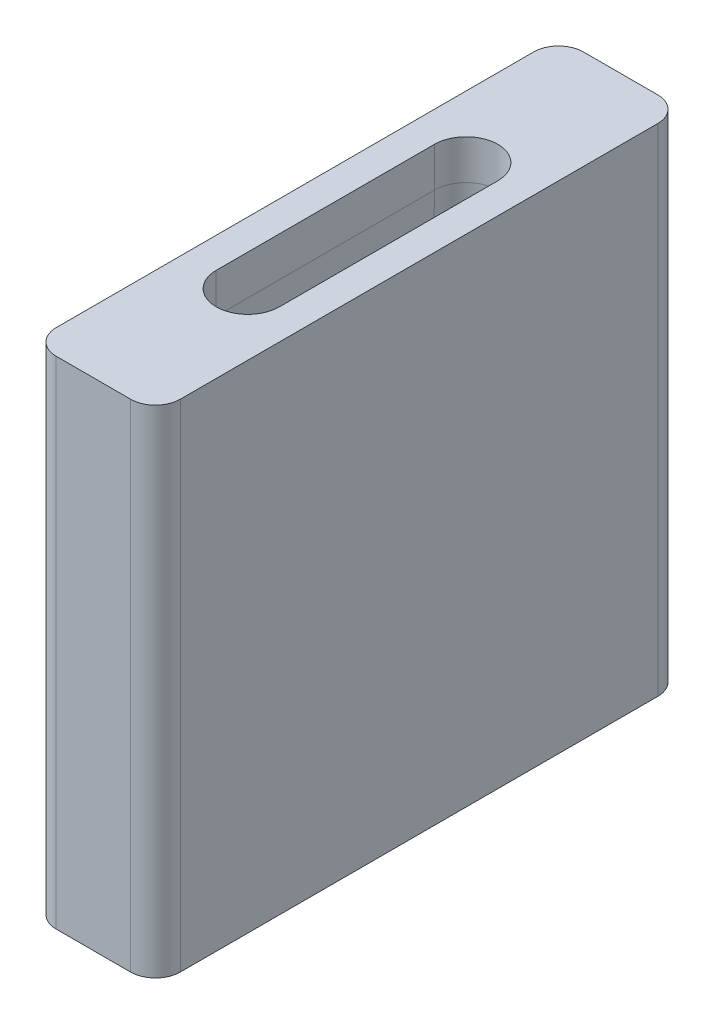
ISO-10303-21;
HEADER;
FILE_DESCRIPTION(('STEP AP214'),'2;1');
FILE_NAME('part.step','',(''),(''),'','','');
FILE_SCHEMA(('AUTOMOTIVE_DESIGN { 1 0 10303 214 1 1 1 1 }'));
ENDSEC;
DATA;
#1=APPLICATION_CONTEXT('core data for automotive mechanical design processes');
#2=APPLICATION_PROTOCOL_DEFINITION('international standard','automotive_design',2000,#1);
#3=PRODUCT_CONTEXT('',#1,'mechanical');
#4=PRODUCT('Part','Part','',(#3));
#5=PRODUCT_RELATED_PRODUCT_CATEGORY('part','',(#4));
#6=PRODUCT_DEFINITION_FORMATION('','',#4);
#7=PRODUCT_DEFINITION_CONTEXT('part definition',#1,'design');
#8=PRODUCT_DEFINITION('design','',#6,#7);
#9=PRODUCT_DEFINITION_SHAPE('','',#8);
#10=(LENGTH_UNIT() NAMED_UNIT(*) SI_UNIT(.MILLI.,.METRE.));
#11=(NAMED_UNIT(*) PLANE_ANGLE_UNIT() SI_UNIT($,.RADIAN.));
#12=(NAMED_UNIT(*) SI_UNIT($,.STERADIAN.) SOLID_ANGLE_UNIT());
#13=UNCERTAINTY_MEASURE_WITH_UNIT(LENGTH_MEASURE(1.E-05),#10,'distance_accuracy_value','');
#14=(GEOMETRIC_REPRESENTATION_CONTEXT(3) GLOBAL_UNCERTAINTY_ASSIGNED_CONTEXT((#13)) GLOBAL_UNIT_ASSIGNED_CONTEXT((#10,
#11,#12)) REPRESENTATION_CONTEXT('',''));
#15=CARTESIAN_POINT('',(0.,0.,0.));
#16=DIRECTION('',(0.,0.,1.));
#17=DIRECTION('',(1.,0.,0.));
#18=AXIS2_PLACEMENT_3D('',#15,#16,#17);
#19=CARTESIAN_POINT('',(0.,-40.001,8.8));
#20=DIRECTION('',(0.,1.,0.));
#21=DIRECTION('',(0.,0.,1.));
#22=AXIS2_PLACEMENT_3D('',#19,#20,#21);
#23=CYLINDRICAL_SURFACE('',#22,2.55);
#24=CARTESIAN_POINT('',(0.,-3.2,8.8));
#25=DIRECTION('',(0.,1.,0.));
#26=DIRECTION('',(-1.,0.,0.));
#27=AXIS2_PLACEMENT_3D('',#24,#25,#26);
#28=CIRCLE('',#27,2.55);
#29=CARTESIAN_POINT('',(-2.55,-3.2,8.8));
#30=VERTEX_POINT('',#29);
#31=CARTESIAN_POINT('',(2.55,-3.20000000000065,8.8));
#32=VERTEX_POINT('',#31);
#33=EDGE_CURVE('E75',#30,#32,#28,.T.);
#34=ORIENTED_EDGE('',*,*,#33,.F.);
#35=DIRECTION('',(0.,1.,0.));
#36=VECTOR('',#35,1.);
#37=CARTESIAN_POINT('',(-2.55,-40.001,8.8));
#38=LINE('',#37,#36);
#39=CARTESIAN_POINT('',(-2.55,0.,8.8));
#40=VERTEX_POINT('',#39);
#41=EDGE_CURVE('E238',#30,#40,#38,.T.);
#42=ORIENTED_EDGE('',*,*,#41,.T.);
#43=CARTESIAN_POINT('',(0.,0.,8.8));
#44=DIRECTION('',(0.,1.,0.));
#45=DIRECTION('',(0.,0.,1.));
#46=AXIS2_PLACEMENT_3D('',#43,#44,#45);
#47=CIRCLE('',#46,2.55);
#48=CARTESIAN_POINT('',(2.55,0.,8.8));
#49=VERTEX_POINT('',#48);
#50=EDGE_CURVE('E224',#40,#49,#47,.T.);
#51=ORIENTED_EDGE('',*,*,#50,.T.);
#52=DIRECTION('',(0.,1.,0.));
#53=VECTOR('',#52,1.);
#54=CARTESIAN_POINT('',(2.55,-40.001,8.8));
#55=LINE('',#54,#53);
#56=EDGE_CURVE('E237',#32,#49,#55,.T.);
#57=ORIENTED_EDGE('',*,*,#56,.F.);
#58=EDGE_LOOP('',(#34,#42,#51,#57));
#59=FACE_BOUND('',#58,.T.);
#60=ADVANCED_FACE('F51',(#59),#23,.F.);
#61=CARTESIAN_POINT('',(-2.55,-40.001,8.8));
#62=DIRECTION('',(-1.,0.,0.));
#63=DIRECTION('',(0.,0.,1.));
#64=AXIS2_PLACEMENT_3D('',#61,#62,#63);
#65=PLANE('',#64);
#66=DIRECTION('',(0.,0.,1.));
#67=VECTOR('',#66,1.);
#68=CARTESIAN_POINT('',(-2.55,-3.2,-8.8));
#69=LINE('',#68,#67);
#70=CARTESIAN_POINT('',(-2.55,-3.2,-8.8));
#71=VERTEX_POINT('',#70);
#72=EDGE_CURVE('E212',#71,#30,#69,.T.);
#73=ORIENTED_EDGE('',*,*,#72,.F.);
#74=DIRECTION('',(0.,1.,0.));
#75=VECTOR('',#74,1.);
#76=CARTESIAN_POINT('',(-2.55,-40.001,-8.8));
#77=LINE('',#76,#75);
#78=CARTESIAN_POINT('',(-2.55,0.,-8.8));
#79=VERTEX_POINT('',#78);
#80=EDGE_CURVE('E241',#71,#79,#77,.T.);
#81=ORIENTED_EDGE('',*,*,#80,.T.);
#82=DIRECTION('',(0.,0.,1.));
#83=VECTOR('',#82,1.);
#84=CARTESIAN_POINT('',(-2.55,0.,8.8));
#85=LINE('',#84,#83);
#86=EDGE_CURVE('E234',#79,#40,#85,.T.);
#87=ORIENTED_EDGE('',*,*,#86,.T.);
#88=ORIENTED_EDGE('',*,*,#41,.F.);
#89=EDGE_LOOP('',(#73,#81,#87,#88));
#90=FACE_BOUND('',#89,.T.);
#91=ADVANCED_FACE('F346',(#90),#65,.F.);
#92=CARTESIAN_POINT('',(0.,-40.001,-8.8));
#93=DIRECTION('',(0.,1.,0.));
#94=DIRECTION('',(0.,0.,1.));
#95=AXIS2_PLACEMENT_3D('',#92,#93,#94);
#96=CYLINDRICAL_SURFACE('',#95,2.55);
#97=CARTESIAN_POINT('',(0.,-3.2,-8.8));
#98=DIRECTION('',(0.,1.,0.));
#99=DIRECTION('',(1.,0.,0.));
#100=AXIS2_PLACEMENT_3D('',#97,#98,#99);
#101=CIRCLE('',#100,2.55);
#102=CARTESIAN_POINT('',(2.55,-3.2,-8.8));
#103=VERTEX_POINT('',#102);
#104=EDGE_CURVE('E204',#103,#71,#101,.T.);
#105=ORIENTED_EDGE('',*,*,#104,.F.);
#106=DIRECTION('',(0.,1.,0.));
#107=VECTOR('',#106,1.);
#108=CARTESIAN_POINT('',(2.55,-40.001,-8.8));
#109=LINE('',#108,#107);
#110=CARTESIAN_POINT('',(2.55,0.,-8.8));
#111=VERTEX_POINT('',#110);
#112=EDGE_CURVE('E243',#103,#111,#109,.T.);
#113=ORIENTED_EDGE('',*,*,#112,.T.);
#114=CARTESIAN_POINT('',(0.,0.,-8.8));
#115=DIRECTION('',(0.,1.,0.));
#116=DIRECTION('',(0.,0.,1.));
#117=AXIS2_PLACEMENT_3D('',#114,#115,#116);
#118=CIRCLE('',#117,2.55);
#119=EDGE_CURVE('E231',#111,#79,#118,.T.);
#120=ORIENTED_EDGE('',*,*,#119,.T.);
#121=ORIENTED_EDGE('',*,*,#80,.F.);
#122=EDGE_LOOP('',(#105,#113,#120,#121));
#123=FACE_BOUND('',#122,.T.);
#124=ADVANCED_FACE('F353',(#123),#96,.F.);
#125=CARTESIAN_POINT('',(2.55,-40.001,8.8));
#126=DIRECTION('',(1.,0.,0.));
#127=DIRECTION('',(0.,0.,-1.));
#128=AXIS2_PLACEMENT_3D('',#125,#126,#127);
#129=PLANE('',#128);
#130=DIRECTION('',(0.,0.,-1.));
#131=VECTOR('',#130,1.);
#132=CARTESIAN_POINT('',(2.55,-3.2,0.));
#133=LINE('',#132,#131);
#134=CARTESIAN_POINT('',(2.55,-3.2,0.));
#135=VERTEX_POINT('',#134);
#136=EDGE_CURVE('E196',#135,#103,#133,.T.);
#137=ORIENTED_EDGE('',*,*,#136,.F.);
#138=DIRECTION('',(0.,0.,-1.));
#139=VECTOR('',#138,1.);
#140=CARTESIAN_POINT('',(2.55,-3.2,8.8));
#141=LINE('',#140,#139);
#142=EDGE_CURVE('E221',#32,#135,#141,.T.);
#143=ORIENTED_EDGE('',*,*,#142,.F.);
#144=ORIENTED_EDGE('',*,*,#56,.T.);
#145=DIRECTION('',(0.,0.,-1.));
#146=VECTOR('',#145,1.);
#147=CARTESIAN_POINT('',(2.55,0.,8.8));
#148=LINE('',#147,#146);
#149=EDGE_CURVE('E228',#49,#111,#148,.T.);
#150=ORIENTED_EDGE('',*,*,#149,.T.);
#151=ORIENTED_EDGE('',*,*,#112,.F.);
#152=EDGE_LOOP('',(#137,#143,#144,#150,#151));
#153=FACE_BOUND('',#152,.T.);
#154=ADVANCED_FACE('F358',(#153),#129,.F.);
#155=CARTESIAN_POINT('',(-3.,-40.,19.25));
#156=DIRECTION('',(0.,1.,0.));
#157=DIRECTION('',(0.,0.,1.));
#158=AXIS2_PLACEMENT_3D('',#155,#156,#157);
#159=CYLINDRICAL_SURFACE('',#158,2.);
#160=CARTESIAN_POINT('',(-3.,0.,19.25));
#161=DIRECTION('',(0.,1.,0.));
#162=DIRECTION('',(0.,0.,-1.));
#163=AXIS2_PLACEMENT_3D('',#160,#161,#162);
#164=CIRCLE('',#163,2.);
#165=CARTESIAN_POINT('',(-5.,0.,19.25));
#166=VERTEX_POINT('',#165);
#167=CARTESIAN_POINT('',(-3.,0.,21.25));
#168=VERTEX_POINT('',#167);
#169=EDGE_CURVE('E240',#166,#168,#164,.T.);
#170=ORIENTED_EDGE('',*,*,#169,.F.);
#171=DIRECTION('',(0.,1.,0.));
#172=VECTOR('',#171,1.);
#173=CARTESIAN_POINT('',(-5.,-40.,19.25));
#174=LINE('',#173,#172);
#175=CARTESIAN_POINT('',(-5.,-40.,19.25));
#176=VERTEX_POINT('',#175);
#177=EDGE_CURVE('E11',#176,#166,#174,.T.);
#178=ORIENTED_EDGE('',*,*,#177,.F.);
#179=CARTESIAN_POINT('',(-3.,-40.,19.25));
#180=DIRECTION('',(0.,1.,0.));
#181=DIRECTION('',(0.,0.,-1.));
#182=AXIS2_PLACEMENT_3D('',#179,#180,#181);
#183=CIRCLE('',#182,2.);
#184=CARTESIAN_POINT('',(-3.,-40.,21.25));
#185=VERTEX_POINT('',#184);
#186=EDGE_CURVE('E246',#176,#185,#183,.T.);
#187=ORIENTED_EDGE('',*,*,#186,.T.);
#188=DIRECTION('',(0.,1.,0.));
#189=VECTOR('',#188,1.);
#190=CARTESIAN_POINT('',(-3.,-40.,21.25));
#191=LINE('',#190,#189);
#192=EDGE_CURVE('E55',#185,#168,#191,.T.);
#193=ORIENTED_EDGE('',*,*,#192,.T.);
#194=EDGE_LOOP('',(#170,#178,#187,#193));
#195=FACE_BOUND('',#194,.T.);
#196=ADVANCED_FACE('F53',(#195),#159,.T.);
#197=CARTESIAN_POINT('',(-5.,-40.,19.25));
#198=DIRECTION('',(-1.,0.,0.));
#199=DIRECTION('',(0.,0.,1.));
#200=AXIS2_PLACEMENT_3D('',#197,#198,#199);
#201=PLANE('',#200);
#202=DIRECTION('',(0.,0.,1.));
#203=VECTOR('',#202,1.);
#204=CARTESIAN_POINT('',(-5.,0.,19.25));
#205=LINE('',#204,#203);
#206=CARTESIAN_POINT('',(-5.,0.,-19.25));
#207=VERTEX_POINT('',#206);
#208=EDGE_CURVE('E250',#207,#166,#205,.T.);
#209=ORIENTED_EDGE('',*,*,#208,.F.);
#210=DIRECTION('',(0.,1.,0.));
#211=VECTOR('',#210,1.);
#212=CARTESIAN_POINT('',(-5.,-40.,-19.25));
#213=LINE('',#212,#211);
#214=CARTESIAN_POINT('',(-5.,-40.,-19.25));
#215=VERTEX_POINT('',#214);
#216=EDGE_CURVE('E60',#215,#207,#213,.T.);
#217=ORIENTED_EDGE('',*,*,#216,.F.);
#218=DIRECTION('',(0.,0.,1.));
#219=VECTOR('',#218,1.);
#220=CARTESIAN_POINT('',(-5.,-40.,19.25));
#221=LINE('',#220,#219);
#222=EDGE_CURVE('E268',#215,#176,#221,.T.);
#223=ORIENTED_EDGE('',*,*,#222,.T.);
#224=ORIENTED_EDGE('',*,*,#177,.T.);
#225=EDGE_LOOP('',(#209,#217,#223,#224));
#226=FACE_BOUND('',#225,.T.);
#227=ADVANCED_FACE('F315',(#226),#201,.T.);
#228=CARTESIAN_POINT('',(-3.,-40.,-19.25));
#229=DIRECTION('',(0.,1.,0.));
#230=DIRECTION('',(0.,0.,1.));
#231=AXIS2_PLACEMENT_3D('',#228,#229,#230);
#232=CYLINDRICAL_SURFACE('',#231,2.);
#233=CARTESIAN_POINT('',(-3.,0.,-19.25));
#234=DIRECTION('',(0.,1.,0.));
#235=DIRECTION('',(0.,0.,-1.));
#236=AXIS2_PLACEMENT_3D('',#233,#234,#235);
#237=CIRCLE('',#236,2.);
#238=CARTESIAN_POINT('',(-3.,0.,-21.25));
#239=VERTEX_POINT('',#238);
#240=EDGE_CURVE('E288',#239,#207,#237,.T.);
#241=ORIENTED_EDGE('',*,*,#240,.F.);
#242=DIRECTION('',(0.,1.,0.));
#243=VECTOR('',#242,1.);
#244=CARTESIAN_POINT('',(-3.,-40.,-21.25));
#245=LINE('',#244,#243);
#246=CARTESIAN_POINT('',(-3.,-40.,-21.25));
#247=VERTEX_POINT('',#246);
#248=EDGE_CURVE('E294',#247,#239,#245,.T.);
#249=ORIENTED_EDGE('',*,*,#248,.F.);
#250=CARTESIAN_POINT('',(-3.,-40.,-19.25));
#251=DIRECTION('',(0.,1.,0.));
#252=DIRECTION('',(0.,0.,-1.));
#253=AXIS2_PLACEMENT_3D('',#250,#251,#252);
#254=CIRCLE('',#253,2.);
#255=EDGE_CURVE('E265',#247,#215,#254,.T.);
#256=ORIENTED_EDGE('',*,*,#255,.T.);
#257=ORIENTED_EDGE('',*,*,#216,.T.);
#258=EDGE_LOOP('',(#241,#249,#256,#257));
#259=FACE_BOUND('',#258,.T.);
#260=ADVANCED_FACE('F336',(#259),#232,.T.);
#261=CARTESIAN_POINT('',(-3.,-40.,-21.25));
#262=DIRECTION('',(0.,0.,-1.));
#263=DIRECTION('',(-1.,0.,0.));
#264=AXIS2_PLACEMENT_3D('',#261,#262,#263);
#265=PLANE('',#264);
#266=DIRECTION('',(-1.,0.,0.));
#267=VECTOR('',#266,1.);
#268=CARTESIAN_POINT('',(-3.,0.,-21.25));
#269=LINE('',#268,#267);
#270=CARTESIAN_POINT('',(3.,0.,-21.25));
#271=VERTEX_POINT('',#270);
#272=EDGE_CURVE('E285',#271,#239,#269,.T.);
#273=ORIENTED_EDGE('',*,*,#272,.F.);
#274=DIRECTION('',(0.,1.,0.));
#275=VECTOR('',#274,1.);
#276=CARTESIAN_POINT('',(3.,-40.,-21.25));
#277=LINE('',#276,#275);
#278=CARTESIAN_POINT('',(3.,-40.,-21.25));
#279=VERTEX_POINT('',#278);
#280=EDGE_CURVE('E296',#279,#271,#277,.T.);
#281=ORIENTED_EDGE('',*,*,#280,.F.);
#282=DIRECTION('',(-1.,0.,0.));
#283=VECTOR('',#282,1.);
#284=CARTESIAN_POINT('',(-3.,-40.,-21.25));
#285=LINE('',#284,#283);
#286=EDGE_CURVE('E262',#279,#247,#285,.T.);
#287=ORIENTED_EDGE('',*,*,#286,.T.);
#288=ORIENTED_EDGE('',*,*,#248,.T.);
#289=EDGE_LOOP('',(#273,#281,#287,#288));
#290=FACE_BOUND('',#289,.T.);
#291=ADVANCED_FACE('F334',(#290),#265,.T.);
#292=CARTESIAN_POINT('',(3.,-40.,-19.25));
#293=DIRECTION('',(0.,1.,0.));
#294=DIRECTION('',(0.,0.,1.));
#295=AXIS2_PLACEMENT_3D('',#292,#293,#294);
#296=CYLINDRICAL_SURFACE('',#295,2.);
#297=CARTESIAN_POINT('',(3.,0.,-19.25));
#298=DIRECTION('',(0.,1.,0.));
#299=DIRECTION('',(0.,0.,-1.));
#300=AXIS2_PLACEMENT_3D('',#297,#298,#299);
#301=CIRCLE('',#300,2.);
#302=CARTESIAN_POINT('',(5.,0.,-19.25));
#303=VERTEX_POINT('',#302);
#304=EDGE_CURVE('E282',#303,#271,#301,.T.);
#305=ORIENTED_EDGE('',*,*,#304,.F.);
#306=DIRECTION('',(0.,1.,0.));
#307=VECTOR('',#306,1.);
#308=CARTESIAN_POINT('',(5.,-40.,-19.25));
#309=LINE('',#308,#307);
#310=CARTESIAN_POINT('',(5.,-40.,-19.25));
#311=VERTEX_POINT('',#310);
#312=EDGE_CURVE('E298',#311,#303,#309,.T.);
#313=ORIENTED_EDGE('',*,*,#312,.F.);
#314=CARTESIAN_POINT('',(3.,-40.,-19.25));
#315=DIRECTION('',(0.,1.,0.));
#316=DIRECTION('',(0.,0.,-1.));
#317=AXIS2_PLACEMENT_3D('',#314,#315,#316);
#318=CIRCLE('',#317,2.);
#319=EDGE_CURVE('E259',#311,#279,#318,.T.);
#320=ORIENTED_EDGE('',*,*,#319,.T.);
#321=ORIENTED_EDGE('',*,*,#280,.T.);
#322=EDGE_LOOP('',(#305,#313,#320,#321));
#323=FACE_BOUND('',#322,.T.);
#324=ADVANCED_FACE('F330',(#323),#296,.T.);
#325=CARTESIAN_POINT('',(5.,-40.,19.25));
#326=DIRECTION('',(1.,0.,0.));
#327=DIRECTION('',(0.,0.,-1.));
#328=AXIS2_PLACEMENT_3D('',#325,#326,#327);
#329=PLANE('',#328);
#330=DIRECTION('',(0.,0.,-1.));
#331=VECTOR('',#330,1.);
#332=CARTESIAN_POINT('',(5.,0.,19.25));
#333=LINE('',#332,#331);
#334=CARTESIAN_POINT('',(5.,0.,19.25));
#335=VERTEX_POINT('',#334);
#336=EDGE_CURVE('E279',#335,#303,#333,.T.);
#337=ORIENTED_EDGE('',*,*,#336,.F.);
#338=DIRECTION('',(0.,1.,0.));
#339=VECTOR('',#338,1.);
#340=CARTESIAN_POINT('',(5.,-40.,19.25));
#341=LINE('',#340,#339);
#342=CARTESIAN_POINT('',(5.,-40.,19.25));
#343=VERTEX_POINT('',#342);
#344=EDGE_CURVE('E300',#343,#335,#341,.T.);
#345=ORIENTED_EDGE('',*,*,#344,.F.);
#346=DIRECTION('',(0.,0.,-1.));
#347=VECTOR('',#346,1.);
#348=CARTESIAN_POINT('',(5.,-40.,19.25));
#349=LINE('',#348,#347);
#350=EDGE_CURVE('E256',#343,#311,#349,.T.);
#351=ORIENTED_EDGE('',*,*,#350,.T.);
#352=ORIENTED_EDGE('',*,*,#312,.T.);
#353=EDGE_LOOP('',(#337,#345,#351,#352));
#354=FACE_BOUND('',#353,.T.);
#355=ADVANCED_FACE('F328',(#354),#329,.T.);
#356=CARTESIAN_POINT('',(3.,-40.,19.25));
#357=DIRECTION('',(0.,1.,0.));
#358=DIRECTION('',(0.,0.,1.));
#359=AXIS2_PLACEMENT_3D('',#356,#357,#358);
#360=CYLINDRICAL_SURFACE('',#359,2.);
#361=CARTESIAN_POINT('',(3.,0.,19.25));
#362=DIRECTION('',(0.,1.,0.));
#363=DIRECTION('',(0.,0.,1.));
#364=AXIS2_PLACEMENT_3D('',#361,#362,#363);
#365=CIRCLE('',#364,2.);
#366=CARTESIAN_POINT('',(3.,0.,21.25));
#367=VERTEX_POINT('',#366);
#368=EDGE_CURVE('E276',#367,#335,#365,.T.);
#369=ORIENTED_EDGE('',*,*,#368,.F.);
#370=DIRECTION('',(0.,1.,0.));
#371=VECTOR('',#370,1.);
#372=CARTESIAN_POINT('',(3.,-40.,21.25));
#373=LINE('',#372,#371);
#374=CARTESIAN_POINT('',(3.,-40.,21.25));
#375=VERTEX_POINT('',#374);
#376=EDGE_CURVE('E301',#375,#367,#373,.T.);
#377=ORIENTED_EDGE('',*,*,#376,.F.);
#378=CARTESIAN_POINT('',(3.,-40.,19.25));
#379=DIRECTION('',(0.,1.,0.));
#380=DIRECTION('',(0.,0.,1.));
#381=AXIS2_PLACEMENT_3D('',#378,#379,#380);
#382=CIRCLE('',#381,2.);
#383=EDGE_CURVE('E253',#375,#343,#382,.T.);
#384=ORIENTED_EDGE('',*,*,#383,.T.);
#385=ORIENTED_EDGE('',*,*,#344,.T.);
#386=EDGE_LOOP('',(#369,#377,#384,#385));
#387=FACE_BOUND('',#386,.T.);
#388=ADVANCED_FACE('F324',(#387),#360,.T.);
#389=CARTESIAN_POINT('',(-3.,-40.,21.25));
#390=DIRECTION('',(0.,0.,1.));
#391=DIRECTION('',(1.,0.,0.));
#392=AXIS2_PLACEMENT_3D('',#389,#390,#391);
#393=PLANE('',#392);
#394=DIRECTION('',(1.,0.,0.));
#395=VECTOR('',#394,1.);
#396=CARTESIAN_POINT('',(-3.,0.,21.25));
#397=LINE('',#396,#395);
#398=EDGE_CURVE('E273',#168,#367,#397,.T.);
#399=ORIENTED_EDGE('',*,*,#398,.F.);
#400=ORIENTED_EDGE('',*,*,#192,.F.);
#401=DIRECTION('',(1.,0.,0.));
#402=VECTOR('',#401,1.);
#403=CARTESIAN_POINT('',(-3.,-40.,21.25));
#404=LINE('',#403,#402);
#405=EDGE_CURVE('E249',#185,#375,#404,.T.);
#406=ORIENTED_EDGE('',*,*,#405,.T.);
#407=ORIENTED_EDGE('',*,*,#376,.T.);
#408=EDGE_LOOP('',(#399,#400,#406,#407));
#409=FACE_BOUND('',#408,.T.);
#410=ADVANCED_FACE('F309',(#409),#393,.T.);
#411=CARTESIAN_POINT('',(-3.,-40.,19.25));
#412=DIRECTION('',(0.,-1.,0.));
#413=DIRECTION('',(0.,0.,-1.));
#414=AXIS2_PLACEMENT_3D('',#411,#412,#413);
#415=PLANE('',#414);
#416=CARTESIAN_POINT('',(0.,-40.,-16.25));
#417=DIRECTION('',(0.,-1.,0.));
#418=DIRECTION('',(0.,0.,-1.));
#419=AXIS2_PLACEMENT_3D('',#416,#417,#418);
#420=CIRCLE('',#419,3.025);
#421=CARTESIAN_POINT('',(0.,-40.,-19.275));
#422=VERTEX_POINT('',#421);
#423=EDGE_CURVE('E181',#422,#422,#420,.T.);
#424=ORIENTED_EDGE('',*,*,#423,.F.);
#425=EDGE_LOOP('',(#424));
#426=FACE_BOUND('',#425,.T.);
#427=CARTESIAN_POINT('',(0.,-40.,16.25));
#428=DIRECTION('',(0.,-1.,0.));
#429=DIRECTION('',(0.,0.,-1.));
#430=AXIS2_PLACEMENT_3D('',#427,#428,#429);
#431=CIRCLE('',#430,3.025);
#432=CARTESIAN_POINT('',(0.,-40.,13.225));
#433=VERTEX_POINT('',#432);
#434=EDGE_CURVE('E174',#433,#433,#431,.T.);
#435=ORIENTED_EDGE('',*,*,#434,.F.);
#436=EDGE_LOOP('',(#435));
#437=FACE_BOUND('',#436,.T.);
#438=CARTESIAN_POINT('',(0.,-40.,8.8));
#439=DIRECTION('',(0.,1.,0.));
#440=DIRECTION('',(-1.,0.,0.));
#441=AXIS2_PLACEMENT_3D('',#438,#439,#440);
#442=CIRCLE('',#441,3.19234638935816);
#443=CARTESIAN_POINT('',(-3.19234638935816,-40.,8.8));
#444=VERTEX_POINT('',#443);
#445=CARTESIAN_POINT('',(3.19234638935816,-40.,8.8));
#446=VERTEX_POINT('',#445);
#447=EDGE_CURVE('E211',#444,#446,#442,.T.);
#448=ORIENTED_EDGE('',*,*,#447,.T.);
#449=DIRECTION('',(0.,0.,-1.));
#450=VECTOR('',#449,1.);
#451=CARTESIAN_POINT('',(3.19234638935816,-40.,8.8));
#452=LINE('',#451,#450);
#453=CARTESIAN_POINT('',(3.19234638935816,-40.,0.));
#454=VERTEX_POINT('',#453);
#455=EDGE_CURVE('E68',#446,#454,#452,.T.);
#456=ORIENTED_EDGE('',*,*,#455,.T.);
#457=DIRECTION('',(0.,0.,-1.));
#458=VECTOR('',#457,1.);
#459=CARTESIAN_POINT('',(3.19234638935816,-40.,0.));
#460=LINE('',#459,#458);
#461=CARTESIAN_POINT('',(3.19234638935816,-40.,-8.8));
#462=VERTEX_POINT('',#461);
#463=EDGE_CURVE('E192',#454,#462,#460,.T.);
#464=ORIENTED_EDGE('',*,*,#463,.T.);
#465=CARTESIAN_POINT('',(0.,-40.,-8.8));
#466=DIRECTION('',(0.,1.,0.));
#467=DIRECTION('',(1.,0.,0.));
#468=AXIS2_PLACEMENT_3D('',#465,#466,#467);
#469=CIRCLE('',#468,3.19234638935816);
#470=CARTESIAN_POINT('',(-3.19234638935816,-40.,-8.8));
#471=VERTEX_POINT('',#470);
#472=EDGE_CURVE('E198',#462,#471,#469,.T.);
#473=ORIENTED_EDGE('',*,*,#472,.T.);
#474=DIRECTION('',(0.,0.,1.));
#475=VECTOR('',#474,1.);
#476=CARTESIAN_POINT('',(-3.19234638935816,-40.,-8.8));
#477=LINE('',#476,#475);
#478=EDGE_CURVE('E206',#471,#444,#477,.T.);
#479=ORIENTED_EDGE('',*,*,#478,.T.);
#480=EDGE_LOOP('',(#448,#456,#464,#473,#479));
#481=FACE_BOUND('',#480,.T.);
#482=ORIENTED_EDGE('',*,*,#186,.F.);
#483=ORIENTED_EDGE('',*,*,#222,.F.);
#484=ORIENTED_EDGE('',*,*,#255,.F.);
#485=ORIENTED_EDGE('',*,*,#286,.F.);
#486=ORIENTED_EDGE('',*,*,#319,.F.);
#487=ORIENTED_EDGE('',*,*,#350,.F.);
#488=ORIENTED_EDGE('',*,*,#383,.F.);
#489=ORIENTED_EDGE('',*,*,#405,.F.);
#490=EDGE_LOOP('',(#482,#483,#484,#485,#486,#487,#488,#489));
#491=FACE_BOUND('',#490,.T.);
#492=ADVANCED_FACE('F318',(#426,#437,#481,#491),#415,.T.);
#493=CARTESIAN_POINT('',(-3.,0.,19.25));
#494=DIRECTION('',(0.,-1.,0.));
#495=DIRECTION('',(0.,0.,-1.));
#496=AXIS2_PLACEMENT_3D('',#493,#494,#495);
#497=PLANE('',#496);
#498=ORIENTED_EDGE('',*,*,#149,.F.);
#499=ORIENTED_EDGE('',*,*,#50,.F.);
#500=ORIENTED_EDGE('',*,*,#86,.F.);
#501=ORIENTED_EDGE('',*,*,#119,.F.);
#502=EDGE_LOOP('',(#498,#499,#500,#501));
#503=FACE_BOUND('',#502,.T.);
#504=ORIENTED_EDGE('',*,*,#169,.T.);
#505=ORIENTED_EDGE('',*,*,#398,.T.);
#506=ORIENTED_EDGE('',*,*,#368,.T.);
#507=ORIENTED_EDGE('',*,*,#336,.T.);
#508=ORIENTED_EDGE('',*,*,#304,.T.);
#509=ORIENTED_EDGE('',*,*,#272,.T.);
#510=ORIENTED_EDGE('',*,*,#240,.T.);
#511=ORIENTED_EDGE('',*,*,#208,.T.);
#512=EDGE_LOOP('',(#504,#505,#506,#507,#508,#509,#510,#511));
#513=FACE_BOUND('',#512,.T.);
#514=ADVANCED_FACE('F311',(#503,#513),#497,.F.);
#515=CARTESIAN_POINT('',(2.55,-3.2,8.8));
#516=DIRECTION('',(-0.999847695156391,-0.0174524064372768,0.));
#517=DIRECTION('',(0.0174524064372768,-0.999847695156391,0.));
#518=AXIS2_PLACEMENT_3D('',#515,#516,#517);
#519=PLANE('',#518);
#520=DIRECTION('',(-0.0174524064372768,0.999847695156391,0.));
#521=VECTOR('',#520,1.);
#522=CARTESIAN_POINT('',(2.55,-3.2,8.8));
#523=LINE('',#522,#521);
#524=EDGE_CURVE('E216',#446,#32,#523,.T.);
#525=ORIENTED_EDGE('',*,*,#524,.T.);
#526=ORIENTED_EDGE('',*,*,#142,.T.);
#527=DIRECTION('',(-0.0174524064372768,0.999847695156391,0.));
#528=VECTOR('',#527,1.);
#529=CARTESIAN_POINT('',(2.55,-3.2,0.));
#530=LINE('',#529,#528);
#531=EDGE_CURVE('E190',#454,#135,#530,.T.);
#532=ORIENTED_EDGE('',*,*,#531,.F.);
#533=ORIENTED_EDGE('',*,*,#455,.F.);
#534=EDGE_LOOP('',(#525,#526,#532,#533));
#535=FACE_BOUND('',#534,.T.);
#536=ADVANCED_FACE('F363',(#535),#519,.T.);
#537=CARTESIAN_POINT('',(2.55,-3.2,0.));
#538=DIRECTION('',(-0.999847695156391,-0.0174524064372768,0.));
#539=DIRECTION('',(0.0174524064372768,-0.999847695156391,0.));
#540=AXIS2_PLACEMENT_3D('',#537,#538,#539);
#541=PLANE('',#540);
#542=ORIENTED_EDGE('',*,*,#136,.T.);
#543=DIRECTION('',(-0.0174524064372768,0.999847695156391,0.));
#544=VECTOR('',#543,1.);
#545=CARTESIAN_POINT('',(2.55,-3.2,-8.8));
#546=LINE('',#545,#544);
#547=EDGE_CURVE('E193',#462,#103,#546,.T.);
#548=ORIENTED_EDGE('',*,*,#547,.F.);
#549=ORIENTED_EDGE('',*,*,#463,.F.);
#550=ORIENTED_EDGE('',*,*,#531,.T.);
#551=EDGE_LOOP('',(#542,#548,#549,#550));
#552=FACE_BOUND('',#551,.T.);
#553=ADVANCED_FACE('F369',(#552),#541,.T.);
#554=CARTESIAN_POINT('',(0.,-40.,-8.8));
#555=DIRECTION('',(0.,-1.,0.));
#556=DIRECTION('',(0.,0.,-1.));
#557=AXIS2_PLACEMENT_3D('',#554,#555,#556);
#558=CONICAL_SURFACE('',#557,3.19234638935816,0.0174532925199366);
#559=ORIENTED_EDGE('',*,*,#104,.T.);
#560=DIRECTION('',(0.0174524064372768,0.999847695156391,0.));
#561=VECTOR('',#560,1.);
#562=CARTESIAN_POINT('',(-2.55,-3.2,-8.8));
#563=LINE('',#562,#561);
#564=EDGE_CURVE('E201',#471,#71,#563,.T.);
#565=ORIENTED_EDGE('',*,*,#564,.F.);
#566=ORIENTED_EDGE('',*,*,#472,.F.);
#567=ORIENTED_EDGE('',*,*,#547,.T.);
#568=EDGE_LOOP('',(#559,#565,#566,#567));
#569=FACE_BOUND('',#568,.T.);
#570=ADVANCED_FACE('F386',(#569),#558,.F.);
#571=CARTESIAN_POINT('',(-2.55,-3.2,-8.8));
#572=DIRECTION('',(0.999847695156391,-0.0174524064372768,0.));
#573=DIRECTION('',(0.0174524064372768,0.999847695156391,0.));
#574=AXIS2_PLACEMENT_3D('',#571,#572,#573);
#575=PLANE('',#574);
#576=ORIENTED_EDGE('',*,*,#72,.T.);
#577=DIRECTION('',(0.0174524064372768,0.999847695156391,0.));
#578=VECTOR('',#577,1.);
#579=CARTESIAN_POINT('',(-2.55,-3.2,8.8));
#580=LINE('',#579,#578);
#581=EDGE_CURVE('E209',#444,#30,#580,.T.);
#582=ORIENTED_EDGE('',*,*,#581,.F.);
#583=ORIENTED_EDGE('',*,*,#478,.F.);
#584=ORIENTED_EDGE('',*,*,#564,.T.);
#585=EDGE_LOOP('',(#576,#582,#583,#584));
#586=FACE_BOUND('',#585,.T.);
#587=ADVANCED_FACE('F390',(#586),#575,.T.);
#588=CARTESIAN_POINT('',(0.,-40.,8.8));
#589=DIRECTION('',(0.,-1.,0.));
#590=DIRECTION('',(0.,0.,-1.));
#591=AXIS2_PLACEMENT_3D('',#588,#589,#590);
#592=CONICAL_SURFACE('',#591,3.19234638935816,0.0174532925199366);
#593=ORIENTED_EDGE('',*,*,#33,.T.);
#594=ORIENTED_EDGE('',*,*,#524,.F.);
#595=ORIENTED_EDGE('',*,*,#447,.F.);
#596=ORIENTED_EDGE('',*,*,#581,.T.);
#597=EDGE_LOOP('',(#593,#594,#595,#596));
#598=FACE_BOUND('',#597,.T.);
#599=ADVANCED_FACE('F395',(#598),#592,.F.);
#600=CARTESIAN_POINT('',(0.,-23.,16.25));
#601=DIRECTION('',(0.,-1.,0.));
#602=DIRECTION('',(0.,0.,-1.));
#603=AXIS2_PLACEMENT_3D('',#600,#601,#602);
#604=CONICAL_SURFACE('',#603,2.5,1.02974425867665);
#605=CARTESIAN_POINT('',(0.,-21.4978484524311,16.25));
#606=VERTEX_POINT('',#605);
#607=VERTEX_LOOP('',#606);
#608=FACE_BOUND('',#607,.T.);
#609=CARTESIAN_POINT('',(0.,-23.,16.25));
#610=DIRECTION('',(0.,-1.,0.));
#611=DIRECTION('',(0.,0.,-1.));
#612=AXIS2_PLACEMENT_3D('',#609,#610,#611);
#613=CIRCLE('',#612,2.5);
#614=CARTESIAN_POINT('',(0.,-23.,13.75));
#615=VERTEX_POINT('',#614);
#616=EDGE_CURVE('E187',#615,#615,#613,.T.);
#617=ORIENTED_EDGE('',*,*,#616,.T.);
#618=EDGE_LOOP('',(#617));
#619=FACE_BOUND('',#618,.T.);
#620=ADVANCED_FACE('F397',(#608,#619),#604,.F.);
#621=CARTESIAN_POINT('',(0.,-40.,16.25));
#622=DIRECTION('',(0.,-1.,0.));
#623=DIRECTION('',(0.,0.,-1.));
#624=AXIS2_PLACEMENT_3D('',#621,#622,#623);
#625=CYLINDRICAL_SURFACE('',#624,2.5);
#626=ORIENTED_EDGE('',*,*,#616,.F.);
#627=EDGE_LOOP('',(#626));
#628=FACE_BOUND('',#627,.T.);
#629=CARTESIAN_POINT('',(0.,-39.475,16.25));
#630=DIRECTION('',(0.,-1.,0.));
#631=DIRECTION('',(0.,0.,-1.));
#632=AXIS2_PLACEMENT_3D('',#629,#630,#631);
#633=CIRCLE('',#632,2.5);
#634=CARTESIAN_POINT('',(0.,-39.475,13.75));
#635=VERTEX_POINT('',#634);
#636=EDGE_CURVE('E178',#635,#635,#633,.T.);
#637=ORIENTED_EDGE('',*,*,#636,.T.);
#638=EDGE_LOOP('',(#637));
#639=FACE_BOUND('',#638,.T.);
#640=ADVANCED_FACE('F403',(#628,#639),#625,.F.);
#641=CARTESIAN_POINT('',(0.,-40.,16.25));
#642=DIRECTION('',(0.,-1.,0.));
#643=DIRECTION('',(0.,0.,-1.));
#644=AXIS2_PLACEMENT_3D('',#641,#642,#643);
#645=CONICAL_SURFACE('',#644,3.025,0.785398163397452);
#646=ORIENTED_EDGE('',*,*,#636,.F.);
#647=EDGE_LOOP('',(#646));
#648=FACE_BOUND('',#647,.T.);
#649=ORIENTED_EDGE('',*,*,#434,.T.);
#650=EDGE_LOOP('',(#649));
#651=FACE_BOUND('',#650,.T.);
#652=ADVANCED_FACE('F168',(#648,#651),#645,.F.);
#653=CARTESIAN_POINT('',(0.,-23.,-16.25));
#654=DIRECTION('',(0.,-1.,0.));
#655=DIRECTION('',(0.,0.,-1.));
#656=AXIS2_PLACEMENT_3D('',#653,#654,#655);
#657=CONICAL_SURFACE('',#656,2.5,1.02974425867665);
#658=CARTESIAN_POINT('',(0.,-21.4978484524311,-16.25));
#659=VERTEX_POINT('',#658);
#660=VERTEX_LOOP('',#659);
#661=FACE_BOUND('',#660,.T.);
#662=CARTESIAN_POINT('',(0.,-23.,-16.25));
#663=DIRECTION('',(0.,-1.,0.));
#664=DIRECTION('',(0.,0.,-1.));
#665=AXIS2_PLACEMENT_3D('',#662,#663,#664);
#666=CIRCLE('',#665,2.5);
#667=CARTESIAN_POINT('',(0.,-23.,-18.75));
#668=VERTEX_POINT('',#667);
#669=EDGE_CURVE('E172',#668,#668,#666,.T.);
#670=ORIENTED_EDGE('',*,*,#669,.T.);
#671=EDGE_LOOP('',(#670));
#672=FACE_BOUND('',#671,.T.);
#673=ADVANCED_FACE('F164',(#661,#672),#657,.F.);
#674=CARTESIAN_POINT('',(0.,-40.,-16.25));
#675=DIRECTION('',(0.,-1.,0.));
#676=DIRECTION('',(0.,0.,-1.));
#677=AXIS2_PLACEMENT_3D('',#674,#675,#676);
#678=CYLINDRICAL_SURFACE('',#677,2.5);
#679=ORIENTED_EDGE('',*,*,#669,.F.);
#680=EDGE_LOOP('',(#679));
#681=FACE_BOUND('',#680,.T.);
#682=CARTESIAN_POINT('',(0.,-39.475,-16.25));
#683=DIRECTION('',(0.,-1.,0.));
#684=DIRECTION('',(0.,0.,-1.));
#685=AXIS2_PLACEMENT_3D('',#682,#683,#684);
#686=CIRCLE('',#685,2.5);
#687=CARTESIAN_POINT('',(0.,-39.475,-18.75));
#688=VERTEX_POINT('',#687);
#689=EDGE_CURVE('E175',#688,#688,#686,.T.);
#690=ORIENTED_EDGE('',*,*,#689,.T.);
#691=EDGE_LOOP('',(#690));
#692=FACE_BOUND('',#691,.T.);
#693=ADVANCED_FACE('F167',(#681,#692),#678,.F.);
#694=CARTESIAN_POINT('',(0.,-40.,-16.25));
#695=DIRECTION('',(0.,-1.,0.));
#696=DIRECTION('',(0.,0.,-1.));
#697=AXIS2_PLACEMENT_3D('',#694,#695,#696);
#698=CONICAL_SURFACE('',#697,3.025,0.785398163397452);
#699=ORIENTED_EDGE('',*,*,#689,.F.);
#700=EDGE_LOOP('',(#699));
#701=FACE_BOUND('',#700,.T.);
#702=ORIENTED_EDGE('',*,*,#423,.T.);
#703=EDGE_LOOP('',(#702));
#704=FACE_BOUND('',#703,.T.);
#705=ADVANCED_FACE('F566',(#701,#704),#698,.F.);
#706=CLOSED_SHELL('',(#60,#91,#124,#154,#196,#227,#260,#291,#324,#355,#388,#410,#492,#514,#536,
#553,#570,#587,#599,#620,#640,#652,#673,#693,#705));
#707=MANIFOLD_SOLID_BREP('B2',#706);
#708=ADVANCED_BREP_SHAPE_REPRESENTATION('',(#18,#707),#14);
#709=SHAPE_DEFINITION_REPRESENTATION(#9,#708);
ENDSEC;
END-ISO-10303-21;
